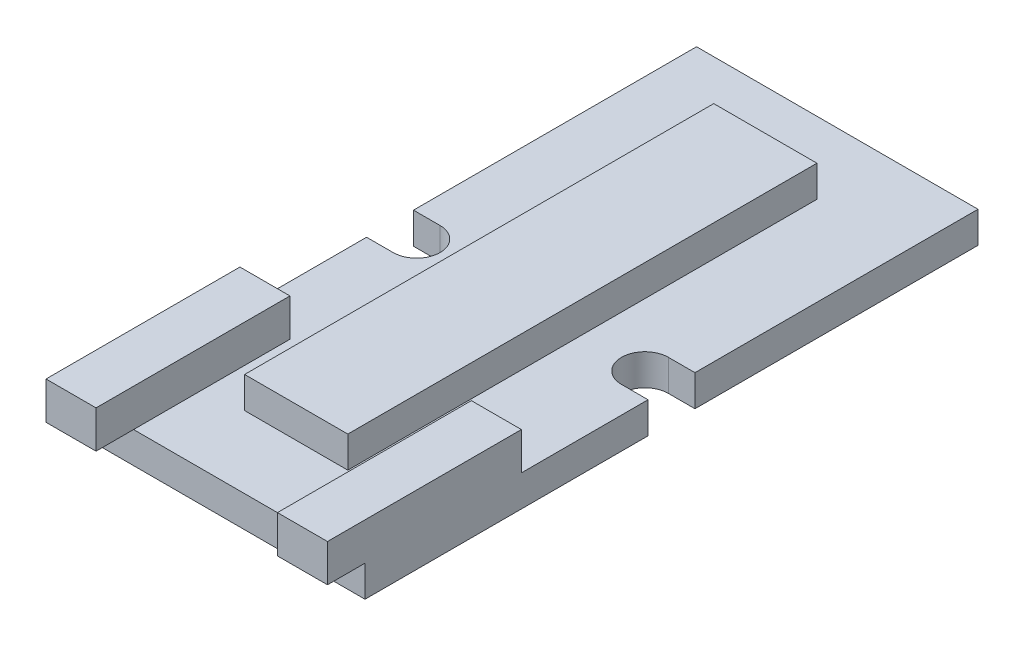
ISO-10303-21;
HEADER;
FILE_DESCRIPTION(('STEP AP214'),'2;1');
FILE_NAME('part.step','',(''),(''),'','','');
FILE_SCHEMA(('AUTOMOTIVE_DESIGN { 1 0 10303 214 1 1 1 1 }'));
ENDSEC;
DATA;
#1=APPLICATION_CONTEXT('core data for automotive mechanical design processes');
#2=APPLICATION_PROTOCOL_DEFINITION('international standard','automotive_design',2000,#1);
#3=PRODUCT_CONTEXT('',#1,'mechanical');
#4=PRODUCT('Part','Part','',(#3));
#5=PRODUCT_RELATED_PRODUCT_CATEGORY('part','',(#4));
#6=PRODUCT_DEFINITION_FORMATION('','',#4);
#7=PRODUCT_DEFINITION_CONTEXT('part definition',#1,'design');
#8=PRODUCT_DEFINITION('design','',#6,#7);
#9=PRODUCT_DEFINITION_SHAPE('','',#8);
#10=(LENGTH_UNIT() NAMED_UNIT(*) SI_UNIT(.MILLI.,.METRE.));
#11=(NAMED_UNIT(*) PLANE_ANGLE_UNIT() SI_UNIT($,.RADIAN.));
#12=(NAMED_UNIT(*) SI_UNIT($,.STERADIAN.) SOLID_ANGLE_UNIT());
#13=UNCERTAINTY_MEASURE_WITH_UNIT(LENGTH_MEASURE(1.E-05),#10,'distance_accuracy_value','');
#14=(GEOMETRIC_REPRESENTATION_CONTEXT(3) GLOBAL_UNCERTAINTY_ASSIGNED_CONTEXT((#13)) GLOBAL_UNIT_ASSIGNED_CONTEXT((#10,
#11,#12)) REPRESENTATION_CONTEXT('',''));
#15=CARTESIAN_POINT('',(0.,0.,0.));
#16=DIRECTION('',(0.,0.,1.));
#17=DIRECTION('',(1.,0.,0.));
#18=AXIS2_PLACEMENT_3D('',#15,#16,#17);
#19=CARTESIAN_POINT('',(0.,1.,9.8));
#20=DIRECTION('',(0.,0.,-1.));
#21=DIRECTION('',(-1.,0.,0.));
#22=AXIS2_PLACEMENT_3D('',#19,#20,#21);
#23=PLANE('',#22);
#24=DIRECTION('',(1.,0.,0.));
#25=VECTOR('',#24,1.);
#26=CARTESIAN_POINT('',(2.9,1.,9.8));
#27=LINE('',#26,#25);
#28=CARTESIAN_POINT('',(2.9,1.,9.8));
#29=VERTEX_POINT('',#28);
#30=CARTESIAN_POINT('',(4.5,1.,9.8));
#31=VERTEX_POINT('',#30);
#32=EDGE_CURVE('E232',#29,#31,#27,.T.);
#33=ORIENTED_EDGE('',*,*,#32,.F.);
#34=DIRECTION('',(1.,0.,0.));
#35=VECTOR('',#34,1.);
#36=CARTESIAN_POINT('',(0.,1.,9.8));
#37=LINE('',#36,#35);
#38=CARTESIAN_POINT('',(-2.9,1.,9.8));
#39=VERTEX_POINT('',#38);
#40=EDGE_CURVE('E390',#39,#29,#37,.T.);
#41=ORIENTED_EDGE('',*,*,#40,.F.);
#42=DIRECTION('',(1.,0.,0.));
#43=VECTOR('',#42,1.);
#44=CARTESIAN_POINT('',(-4.5,1.,9.8));
#45=LINE('',#44,#43);
#46=CARTESIAN_POINT('',(-4.5,1.,9.8));
#47=VERTEX_POINT('',#46);
#48=EDGE_CURVE('E57',#47,#39,#45,.T.);
#49=ORIENTED_EDGE('',*,*,#48,.F.);
#50=DIRECTION('',(0.,-1.,0.));
#51=VECTOR('',#50,1.);
#52=CARTESIAN_POINT('',(-4.5,1.,9.8));
#53=LINE('',#52,#51);
#54=CARTESIAN_POINT('',(-4.5,0.,9.8));
#55=VERTEX_POINT('',#54);
#56=EDGE_CURVE('E445',#47,#55,#53,.T.);
#57=ORIENTED_EDGE('',*,*,#56,.T.);
#58=DIRECTION('',(1.,0.,0.));
#59=VECTOR('',#58,1.);
#60=CARTESIAN_POINT('',(0.,0.,9.8));
#61=LINE('',#60,#59);
#62=CARTESIAN_POINT('',(4.5,0.,9.8));
#63=VERTEX_POINT('',#62);
#64=EDGE_CURVE('E430',#55,#63,#61,.T.);
#65=ORIENTED_EDGE('',*,*,#64,.T.);
#66=DIRECTION('',(0.,-1.,0.));
#67=VECTOR('',#66,1.);
#68=CARTESIAN_POINT('',(4.5,1.,9.8));
#69=LINE('',#68,#67);
#70=EDGE_CURVE('E442',#31,#63,#69,.T.);
#71=ORIENTED_EDGE('',*,*,#70,.F.);
#72=EDGE_LOOP('',(#33,#41,#49,#57,#65,#71));
#73=FACE_BOUND('',#72,.T.);
#74=ADVANCED_FACE('F41',(#73),#23,.F.);
#75=CARTESIAN_POINT('',(0.,1.,0.));
#76=DIRECTION('',(0.,1.,0.));
#77=DIRECTION('',(0.,0.,1.));
#78=AXIS2_PLACEMENT_3D('',#75,#76,#77);
#79=PLANE('',#78);
#80=DIRECTION('',(0.,0.,-1.));
#81=VECTOR('',#80,1.);
#82=CARTESIAN_POINT('',(1.65,1.,7.5));
#83=LINE('',#82,#81);
#84=CARTESIAN_POINT('',(1.65,1.,7.5));
#85=VERTEX_POINT('',#84);
#86=CARTESIAN_POINT('',(1.65,1.,-7.5));
#87=VERTEX_POINT('',#86);
#88=EDGE_CURVE('E311',#85,#87,#83,.T.);
#89=ORIENTED_EDGE('',*,*,#88,.F.);
#90=DIRECTION('',(1.,0.,0.));
#91=VECTOR('',#90,1.);
#92=CARTESIAN_POINT('',(-1.65,1.,7.5));
#93=LINE('',#92,#91);
#94=CARTESIAN_POINT('',(-1.65,1.,7.5));
#95=VERTEX_POINT('',#94);
#96=EDGE_CURVE('E317',#95,#85,#93,.T.);
#97=ORIENTED_EDGE('',*,*,#96,.F.);
#98=DIRECTION('',(0.,0.,1.));
#99=VECTOR('',#98,1.);
#100=CARTESIAN_POINT('',(-1.65,1.,7.5));
#101=LINE('',#100,#99);
#102=CARTESIAN_POINT('',(-1.65,1.,-7.5));
#103=VERTEX_POINT('',#102);
#104=EDGE_CURVE('E334',#103,#95,#101,.T.);
#105=ORIENTED_EDGE('',*,*,#104,.F.);
#106=DIRECTION('',(-1.,0.,0.));
#107=VECTOR('',#106,1.);
#108=CARTESIAN_POINT('',(-1.65,1.,-7.5));
#109=LINE('',#108,#107);
#110=EDGE_CURVE('E330',#87,#103,#109,.T.);
#111=ORIENTED_EDGE('',*,*,#110,.F.);
#112=EDGE_LOOP('',(#89,#97,#105,#111));
#113=FACE_BOUND('',#112,.T.);
#114=DIRECTION('',(0.,0.,1.));
#115=VECTOR('',#114,1.);
#116=CARTESIAN_POINT('',(2.9,1.,9.8));
#117=LINE('',#116,#115);
#118=CARTESIAN_POINT('',(2.9,1.,4.8));
#119=VERTEX_POINT('',#118);
#120=EDGE_CURVE('E65',#119,#29,#117,.T.);
#121=ORIENTED_EDGE('',*,*,#120,.F.);
#122=DIRECTION('',(-1.,0.,0.));
#123=VECTOR('',#122,1.);
#124=CARTESIAN_POINT('',(4.5,1.,4.8));
#125=LINE('',#124,#123);
#126=CARTESIAN_POINT('',(4.5,1.,4.8));
#127=VERTEX_POINT('',#126);
#128=EDGE_CURVE('E267',#127,#119,#125,.T.);
#129=ORIENTED_EDGE('',*,*,#128,.F.);
#130=DIRECTION('',(0.,0.,-1.));
#131=VECTOR('',#130,1.);
#132=CARTESIAN_POINT('',(4.5,1.,0.));
#133=LINE('',#132,#131);
#134=CARTESIAN_POINT('',(4.5,1.,0.75));
#135=VERTEX_POINT('',#134);
#136=EDGE_CURVE('E369',#127,#135,#133,.T.);
#137=ORIENTED_EDGE('',*,*,#136,.T.);
#138=DIRECTION('',(1.,0.,0.));
#139=VECTOR('',#138,1.);
#140=CARTESIAN_POINT('',(0.,1.,0.75));
#141=LINE('',#140,#139);
#142=CARTESIAN_POINT('',(3.65,1.,0.75));
#143=VERTEX_POINT('',#142);
#144=EDGE_CURVE('E393',#143,#135,#141,.T.);
#145=ORIENTED_EDGE('',*,*,#144,.F.);
#146=CARTESIAN_POINT('',(3.65,1.,0.));
#147=DIRECTION('',(0.,1.,0.));
#148=DIRECTION('',(0.,0.,1.));
#149=AXIS2_PLACEMENT_3D('',#146,#147,#148);
#150=CIRCLE('',#149,0.750000000000001);
#151=CARTESIAN_POINT('',(3.65,1.,-0.75));
#152=VERTEX_POINT('',#151);
#153=EDGE_CURVE('E357',#152,#143,#150,.T.);
#154=ORIENTED_EDGE('',*,*,#153,.F.);
#155=DIRECTION('',(1.,0.,0.));
#156=VECTOR('',#155,1.);
#157=CARTESIAN_POINT('',(0.,1.,-0.75));
#158=LINE('',#157,#156);
#159=CARTESIAN_POINT('',(4.5,1.,-0.75));
#160=VERTEX_POINT('',#159);
#161=EDGE_CURVE('E361',#152,#160,#158,.T.);
#162=ORIENTED_EDGE('',*,*,#161,.T.);
#163=CARTESIAN_POINT('',(4.5,1.,-9.8));
#164=VERTEX_POINT('',#163);
#165=EDGE_CURVE('E365',#160,#164,#133,.T.);
#166=ORIENTED_EDGE('',*,*,#165,.T.);
#167=DIRECTION('',(1.,0.,0.));
#168=VECTOR('',#167,1.);
#169=CARTESIAN_POINT('',(0.,1.,-9.8));
#170=LINE('',#169,#168);
#171=CARTESIAN_POINT('',(-4.5,1.,-9.8));
#172=VERTEX_POINT('',#171);
#173=EDGE_CURVE('E368',#172,#164,#170,.T.);
#174=ORIENTED_EDGE('',*,*,#173,.F.);
#175=DIRECTION('',(0.,0.,-1.));
#176=VECTOR('',#175,1.);
#177=CARTESIAN_POINT('',(-4.5,1.,0.));
#178=LINE('',#177,#176);
#179=CARTESIAN_POINT('',(-4.5,1.,-0.75));
#180=VERTEX_POINT('',#179);
#181=EDGE_CURVE('E373',#180,#172,#178,.T.);
#182=ORIENTED_EDGE('',*,*,#181,.F.);
#183=DIRECTION('',(-1.,0.,0.));
#184=VECTOR('',#183,1.);
#185=CARTESIAN_POINT('',(0.,1.,-0.75));
#186=LINE('',#185,#184);
#187=CARTESIAN_POINT('',(-3.65,1.,-0.75));
#188=VERTEX_POINT('',#187);
#189=EDGE_CURVE('E377',#188,#180,#186,.T.);
#190=ORIENTED_EDGE('',*,*,#189,.F.);
#191=CARTESIAN_POINT('',(-3.65,1.,0.));
#192=DIRECTION('',(0.,1.,0.));
#193=DIRECTION('',(0.,0.,1.));
#194=AXIS2_PLACEMENT_3D('',#191,#192,#193);
#195=CIRCLE('',#194,0.75);
#196=CARTESIAN_POINT('',(-3.65,1.,0.75));
#197=VERTEX_POINT('',#196);
#198=EDGE_CURVE('E382',#197,#188,#195,.T.);
#199=ORIENTED_EDGE('',*,*,#198,.F.);
#200=DIRECTION('',(-1.,0.,0.));
#201=VECTOR('',#200,1.);
#202=CARTESIAN_POINT('',(0.,1.,0.75));
#203=LINE('',#202,#201);
#204=CARTESIAN_POINT('',(-4.5,1.,0.75));
#205=VERTEX_POINT('',#204);
#206=EDGE_CURVE('E386',#197,#205,#203,.T.);
#207=ORIENTED_EDGE('',*,*,#206,.T.);
#208=CARTESIAN_POINT('',(-4.5,1.,4.8));
#209=VERTEX_POINT('',#208);
#210=EDGE_CURVE('E378',#209,#205,#178,.T.);
#211=ORIENTED_EDGE('',*,*,#210,.F.);
#212=DIRECTION('',(-1.,0.,0.));
#213=VECTOR('',#212,1.);
#214=CARTESIAN_POINT('',(-4.5,1.,4.8));
#215=LINE('',#214,#213);
#216=CARTESIAN_POINT('',(-2.9,1.,4.8));
#217=VERTEX_POINT('',#216);
#218=EDGE_CURVE('E293',#217,#209,#215,.T.);
#219=ORIENTED_EDGE('',*,*,#218,.F.);
#220=DIRECTION('',(0.,0.,-1.));
#221=VECTOR('',#220,1.);
#222=CARTESIAN_POINT('',(-2.9,1.,9.8));
#223=LINE('',#222,#221);
#224=EDGE_CURVE('E288',#39,#217,#223,.T.);
#225=ORIENTED_EDGE('',*,*,#224,.F.);
#226=ORIENTED_EDGE('',*,*,#40,.T.);
#227=EDGE_LOOP('',(#121,#129,#137,#145,#154,#162,#166,#174,#182,#190,#199,#207,#211,#219,#225,#226));
#228=FACE_BOUND('',#227,.T.);
#229=ADVANCED_FACE('F485',(#113,#228),#79,.T.);
#230=CARTESIAN_POINT('',(3.65,1.,0.));
#231=DIRECTION('',(0.,-1.,0.));
#232=DIRECTION('',(0.,0.,-1.));
#233=AXIS2_PLACEMENT_3D('',#230,#231,#232);
#234=CYLINDRICAL_SURFACE('',#233,0.750000000000001);
#235=CARTESIAN_POINT('',(3.65,0.,0.));
#236=DIRECTION('',(0.,1.,0.));
#237=DIRECTION('',(0.,0.,1.));
#238=AXIS2_PLACEMENT_3D('',#235,#236,#237);
#239=CIRCLE('',#238,0.750000000000001);
#240=CARTESIAN_POINT('',(3.65,0.,-0.75));
#241=VERTEX_POINT('',#240);
#242=CARTESIAN_POINT('',(3.65,0.,0.75));
#243=VERTEX_POINT('',#242);
#244=EDGE_CURVE('E356',#241,#243,#239,.T.);
#245=ORIENTED_EDGE('',*,*,#244,.F.);
#246=DIRECTION('',(0.,-1.,0.));
#247=VECTOR('',#246,1.);
#248=CARTESIAN_POINT('',(3.65,1.,-0.75));
#249=LINE('',#248,#247);
#250=EDGE_CURVE('E11',#152,#241,#249,.T.);
#251=ORIENTED_EDGE('',*,*,#250,.F.);
#252=ORIENTED_EDGE('',*,*,#153,.T.);
#253=DIRECTION('',(0.,-1.,0.));
#254=VECTOR('',#253,1.);
#255=CARTESIAN_POINT('',(3.65,1.,0.75));
#256=LINE('',#255,#254);
#257=EDGE_CURVE('E397',#143,#243,#256,.T.);
#258=ORIENTED_EDGE('',*,*,#257,.T.);
#259=EDGE_LOOP('',(#245,#251,#252,#258));
#260=FACE_BOUND('',#259,.T.);
#261=ADVANCED_FACE('F43',(#260),#234,.F.);
#262=CARTESIAN_POINT('',(0.,1.,-0.75));
#263=DIRECTION('',(0.,0.,-1.));
#264=DIRECTION('',(-1.,0.,0.));
#265=AXIS2_PLACEMENT_3D('',#262,#263,#264);
#266=PLANE('',#265);
#267=DIRECTION('',(1.,0.,0.));
#268=VECTOR('',#267,1.);
#269=CARTESIAN_POINT('',(0.,0.,-0.75));
#270=LINE('',#269,#268);
#271=CARTESIAN_POINT('',(4.5,0.,-0.75));
#272=VERTEX_POINT('',#271);
#273=EDGE_CURVE('E401',#241,#272,#270,.T.);
#274=ORIENTED_EDGE('',*,*,#273,.T.);
#275=DIRECTION('',(0.,-1.,0.));
#276=VECTOR('',#275,1.);
#277=CARTESIAN_POINT('',(4.5,1.,-0.75));
#278=LINE('',#277,#276);
#279=EDGE_CURVE('E50',#160,#272,#278,.T.);
#280=ORIENTED_EDGE('',*,*,#279,.F.);
#281=ORIENTED_EDGE('',*,*,#161,.F.);
#282=ORIENTED_EDGE('',*,*,#250,.T.);
#283=EDGE_LOOP('',(#274,#280,#281,#282));
#284=FACE_BOUND('',#283,.T.);
#285=ADVANCED_FACE('F556',(#284),#266,.F.);
#286=CARTESIAN_POINT('',(4.5,1.,0.));
#287=DIRECTION('',(-1.,0.,0.));
#288=DIRECTION('',(0.,0.,1.));
#289=AXIS2_PLACEMENT_3D('',#286,#287,#288);
#290=PLANE('',#289);
#291=DIRECTION('',(0.,0.,-1.));
#292=VECTOR('',#291,1.);
#293=CARTESIAN_POINT('',(4.5,0.,0.));
#294=LINE('',#293,#292);
#295=CARTESIAN_POINT('',(4.5,0.,-9.8));
#296=VERTEX_POINT('',#295);
#297=EDGE_CURVE('E404',#272,#296,#294,.T.);
#298=ORIENTED_EDGE('',*,*,#297,.T.);
#299=DIRECTION('',(0.,-1.,0.));
#300=VECTOR('',#299,1.);
#301=CARTESIAN_POINT('',(4.5,1.,-9.8));
#302=LINE('',#301,#300);
#303=EDGE_CURVE('E463',#164,#296,#302,.T.);
#304=ORIENTED_EDGE('',*,*,#303,.F.);
#305=ORIENTED_EDGE('',*,*,#165,.F.);
#306=ORIENTED_EDGE('',*,*,#279,.T.);
#307=EDGE_LOOP('',(#298,#304,#305,#306));
#308=FACE_BOUND('',#307,.T.);
#309=ADVANCED_FACE('F471',(#308),#290,.F.);
#310=CARTESIAN_POINT('',(0.,1.,-9.8));
#311=DIRECTION('',(0.,0.,-1.));
#312=DIRECTION('',(-1.,0.,0.));
#313=AXIS2_PLACEMENT_3D('',#310,#311,#312);
#314=PLANE('',#313);
#315=DIRECTION('',(1.,0.,0.));
#316=VECTOR('',#315,1.);
#317=CARTESIAN_POINT('',(0.,0.,-9.8));
#318=LINE('',#317,#316);
#319=CARTESIAN_POINT('',(-4.5,0.,-9.8));
#320=VERTEX_POINT('',#319);
#321=EDGE_CURVE('E408',#320,#296,#318,.T.);
#322=ORIENTED_EDGE('',*,*,#321,.F.);
#323=DIRECTION('',(0.,-1.,0.));
#324=VECTOR('',#323,1.);
#325=CARTESIAN_POINT('',(-4.5,1.,-9.8));
#326=LINE('',#325,#324);
#327=EDGE_CURVE('E460',#172,#320,#326,.T.);
#328=ORIENTED_EDGE('',*,*,#327,.F.);
#329=ORIENTED_EDGE('',*,*,#173,.T.);
#330=ORIENTED_EDGE('',*,*,#303,.T.);
#331=EDGE_LOOP('',(#322,#328,#329,#330));
#332=FACE_BOUND('',#331,.T.);
#333=ADVANCED_FACE('F482',(#332),#314,.T.);
#334=CARTESIAN_POINT('',(-4.5,1.,0.));
#335=DIRECTION('',(-1.,0.,0.));
#336=DIRECTION('',(0.,0.,1.));
#337=AXIS2_PLACEMENT_3D('',#334,#335,#336);
#338=PLANE('',#337);
#339=DIRECTION('',(0.,0.,-1.));
#340=VECTOR('',#339,1.);
#341=CARTESIAN_POINT('',(-4.5,0.,0.));
#342=LINE('',#341,#340);
#343=CARTESIAN_POINT('',(-4.5,0.,-0.75));
#344=VERTEX_POINT('',#343);
#345=EDGE_CURVE('E413',#344,#320,#342,.T.);
#346=ORIENTED_EDGE('',*,*,#345,.F.);
#347=DIRECTION('',(0.,-1.,0.));
#348=VECTOR('',#347,1.);
#349=CARTESIAN_POINT('',(-4.5,1.,-0.75));
#350=LINE('',#349,#348);
#351=EDGE_CURVE('E457',#180,#344,#350,.T.);
#352=ORIENTED_EDGE('',*,*,#351,.F.);
#353=ORIENTED_EDGE('',*,*,#181,.T.);
#354=ORIENTED_EDGE('',*,*,#327,.T.);
#355=EDGE_LOOP('',(#346,#352,#353,#354));
#356=FACE_BOUND('',#355,.T.);
#357=ADVANCED_FACE('F488',(#356),#338,.T.);
#358=CARTESIAN_POINT('',(0.,1.,-0.75));
#359=DIRECTION('',(0.,0.,1.));
#360=DIRECTION('',(1.,0.,0.));
#361=AXIS2_PLACEMENT_3D('',#358,#359,#360);
#362=PLANE('',#361);
#363=DIRECTION('',(-1.,0.,0.));
#364=VECTOR('',#363,1.);
#365=CARTESIAN_POINT('',(0.,0.,-0.75));
#366=LINE('',#365,#364);
#367=CARTESIAN_POINT('',(-3.65,0.,-0.75));
#368=VERTEX_POINT('',#367);
#369=EDGE_CURVE('E417',#368,#344,#366,.T.);
#370=ORIENTED_EDGE('',*,*,#369,.F.);
#371=DIRECTION('',(0.,-1.,0.));
#372=VECTOR('',#371,1.);
#373=CARTESIAN_POINT('',(-3.65,1.,-0.75));
#374=LINE('',#373,#372);
#375=EDGE_CURVE('E454',#188,#368,#374,.T.);
#376=ORIENTED_EDGE('',*,*,#375,.F.);
#377=ORIENTED_EDGE('',*,*,#189,.T.);
#378=ORIENTED_EDGE('',*,*,#351,.T.);
#379=EDGE_LOOP('',(#370,#376,#377,#378));
#380=FACE_BOUND('',#379,.T.);
#381=ADVANCED_FACE('F491',(#380),#362,.T.);
#382=CARTESIAN_POINT('',(-3.65,1.,0.));
#383=DIRECTION('',(0.,-1.,0.));
#384=DIRECTION('',(0.,0.,-1.));
#385=AXIS2_PLACEMENT_3D('',#382,#383,#384);
#386=CYLINDRICAL_SURFACE('',#385,0.75);
#387=CARTESIAN_POINT('',(-3.65,0.,0.));
#388=DIRECTION('',(0.,1.,0.));
#389=DIRECTION('',(0.,0.,1.));
#390=AXIS2_PLACEMENT_3D('',#387,#388,#389);
#391=CIRCLE('',#390,0.75);
#392=CARTESIAN_POINT('',(-3.65,0.,0.75));
#393=VERTEX_POINT('',#392);
#394=EDGE_CURVE('E422',#393,#368,#391,.T.);
#395=ORIENTED_EDGE('',*,*,#394,.F.);
#396=DIRECTION('',(0.,-1.,0.));
#397=VECTOR('',#396,1.);
#398=CARTESIAN_POINT('',(-3.65,1.,0.75));
#399=LINE('',#398,#397);
#400=EDGE_CURVE('E451',#197,#393,#399,.T.);
#401=ORIENTED_EDGE('',*,*,#400,.F.);
#402=ORIENTED_EDGE('',*,*,#198,.T.);
#403=ORIENTED_EDGE('',*,*,#375,.T.);
#404=EDGE_LOOP('',(#395,#401,#402,#403));
#405=FACE_BOUND('',#404,.T.);
#406=ADVANCED_FACE('F495',(#405),#386,.F.);
#407=CARTESIAN_POINT('',(0.,1.,0.75));
#408=DIRECTION('',(0.,0.,1.));
#409=DIRECTION('',(1.,0.,0.));
#410=AXIS2_PLACEMENT_3D('',#407,#408,#409);
#411=PLANE('',#410);
#412=DIRECTION('',(-1.,0.,0.));
#413=VECTOR('',#412,1.);
#414=CARTESIAN_POINT('',(0.,0.,0.75));
#415=LINE('',#414,#413);
#416=CARTESIAN_POINT('',(-4.5,0.,0.75));
#417=VERTEX_POINT('',#416);
#418=EDGE_CURVE('E426',#393,#417,#415,.T.);
#419=ORIENTED_EDGE('',*,*,#418,.T.);
#420=DIRECTION('',(0.,-1.,0.));
#421=VECTOR('',#420,1.);
#422=CARTESIAN_POINT('',(-4.5,1.,0.75));
#423=LINE('',#422,#421);
#424=EDGE_CURVE('E448',#205,#417,#423,.T.);
#425=ORIENTED_EDGE('',*,*,#424,.F.);
#426=ORIENTED_EDGE('',*,*,#206,.F.);
#427=ORIENTED_EDGE('',*,*,#400,.T.);
#428=EDGE_LOOP('',(#419,#425,#426,#427));
#429=FACE_BOUND('',#428,.T.);
#430=ADVANCED_FACE('F500',(#429),#411,.F.);
#431=EDGE_CURVE('E418',#55,#417,#342,.T.);
#432=ORIENTED_EDGE('',*,*,#431,.F.);
#433=ORIENTED_EDGE('',*,*,#56,.F.);
#434=DIRECTION('',(0.,0.,-1.));
#435=VECTOR('',#434,1.);
#436=CARTESIAN_POINT('',(-4.5,1.,11.));
#437=LINE('',#436,#435);
#438=CARTESIAN_POINT('',(-4.5,1.,11.));
#439=VERTEX_POINT('',#438);
#440=EDGE_CURVE('E263',#439,#47,#437,.T.);
#441=ORIENTED_EDGE('',*,*,#440,.F.);
#442=DIRECTION('',(0.,-1.,0.));
#443=VECTOR('',#442,1.);
#444=CARTESIAN_POINT('',(-4.5,2.2,11.));
#445=LINE('',#444,#443);
#446=CARTESIAN_POINT('',(-4.5,2.2,11.));
#447=VERTEX_POINT('',#446);
#448=EDGE_CURVE('E240',#447,#439,#445,.T.);
#449=ORIENTED_EDGE('',*,*,#448,.F.);
#450=DIRECTION('',(0.,0.,1.));
#451=VECTOR('',#450,1.);
#452=CARTESIAN_POINT('',(-4.5,2.2,9.8));
#453=LINE('',#452,#451);
#454=CARTESIAN_POINT('',(-4.5,2.2,4.8));
#455=VERTEX_POINT('',#454);
#456=EDGE_CURVE('E289',#455,#447,#453,.T.);
#457=ORIENTED_EDGE('',*,*,#456,.F.);
#458=DIRECTION('',(0.,-1.,0.));
#459=VECTOR('',#458,1.);
#460=CARTESIAN_POINT('',(-4.5,2.2,4.8));
#461=LINE('',#460,#459);
#462=EDGE_CURVE('E299',#455,#209,#461,.T.);
#463=ORIENTED_EDGE('',*,*,#462,.T.);
#464=ORIENTED_EDGE('',*,*,#210,.T.);
#465=ORIENTED_EDGE('',*,*,#424,.T.);
#466=EDGE_LOOP('',(#432,#433,#441,#449,#457,#463,#464,#465));
#467=FACE_BOUND('',#466,.T.);
#468=ADVANCED_FACE('F514',(#467),#338,.T.);
#469=CARTESIAN_POINT('',(4.5,0.,0.75));
#470=VERTEX_POINT('',#469);
#471=EDGE_CURVE('E409',#63,#470,#294,.T.);
#472=ORIENTED_EDGE('',*,*,#471,.T.);
#473=DIRECTION('',(0.,-1.,0.));
#474=VECTOR('',#473,1.);
#475=CARTESIAN_POINT('',(4.5,1.,0.75));
#476=LINE('',#475,#474);
#477=EDGE_CURVE('E439',#135,#470,#476,.T.);
#478=ORIENTED_EDGE('',*,*,#477,.F.);
#479=ORIENTED_EDGE('',*,*,#136,.F.);
#480=DIRECTION('',(0.,-1.,0.));
#481=VECTOR('',#480,1.);
#482=CARTESIAN_POINT('',(4.5,2.2,4.8));
#483=LINE('',#482,#481);
#484=CARTESIAN_POINT('',(4.5,2.2,4.8));
#485=VERTEX_POINT('',#484);
#486=EDGE_CURVE('E284',#485,#127,#483,.T.);
#487=ORIENTED_EDGE('',*,*,#486,.F.);
#488=DIRECTION('',(0.,0.,-1.));
#489=VECTOR('',#488,1.);
#490=CARTESIAN_POINT('',(4.5,2.2,9.8));
#491=LINE('',#490,#489);
#492=CARTESIAN_POINT('',(4.5,2.2,11.));
#493=VERTEX_POINT('',#492);
#494=EDGE_CURVE('E268',#493,#485,#491,.T.);
#495=ORIENTED_EDGE('',*,*,#494,.F.);
#496=DIRECTION('',(0.,1.,0.));
#497=VECTOR('',#496,1.);
#498=CARTESIAN_POINT('',(4.5,2.2,11.));
#499=LINE('',#498,#497);
#500=CARTESIAN_POINT('',(4.5,1.,11.));
#501=VERTEX_POINT('',#500);
#502=EDGE_CURVE('E221',#501,#493,#499,.T.);
#503=ORIENTED_EDGE('',*,*,#502,.F.);
#504=DIRECTION('',(0.,0.,-1.));
#505=VECTOR('',#504,1.);
#506=CARTESIAN_POINT('',(4.5,1.,11.));
#507=LINE('',#506,#505);
#508=EDGE_CURVE('E216',#501,#31,#507,.T.);
#509=ORIENTED_EDGE('',*,*,#508,.T.);
#510=ORIENTED_EDGE('',*,*,#70,.T.);
#511=EDGE_LOOP('',(#472,#478,#479,#487,#495,#503,#509,#510));
#512=FACE_BOUND('',#511,.T.);
#513=ADVANCED_FACE('F551',(#512),#290,.F.);
#514=CARTESIAN_POINT('',(0.,1.,0.75));
#515=DIRECTION('',(0.,0.,-1.));
#516=DIRECTION('',(-1.,0.,0.));
#517=AXIS2_PLACEMENT_3D('',#514,#515,#516);
#518=PLANE('',#517);
#519=DIRECTION('',(1.,0.,0.));
#520=VECTOR('',#519,1.);
#521=CARTESIAN_POINT('',(0.,0.,0.75));
#522=LINE('',#521,#520);
#523=EDGE_CURVE('E362',#243,#470,#522,.T.);
#524=ORIENTED_EDGE('',*,*,#523,.F.);
#525=ORIENTED_EDGE('',*,*,#257,.F.);
#526=ORIENTED_EDGE('',*,*,#144,.T.);
#527=ORIENTED_EDGE('',*,*,#477,.T.);
#528=EDGE_LOOP('',(#524,#525,#526,#527));
#529=FACE_BOUND('',#528,.T.);
#530=ADVANCED_FACE('F554',(#529),#518,.T.);
#531=CARTESIAN_POINT('',(0.,0.,0.));
#532=DIRECTION('',(0.,1.,0.));
#533=DIRECTION('',(0.,0.,1.));
#534=AXIS2_PLACEMENT_3D('',#531,#532,#533);
#535=PLANE('',#534);
#536=ORIENTED_EDGE('',*,*,#244,.T.);
#537=ORIENTED_EDGE('',*,*,#523,.T.);
#538=ORIENTED_EDGE('',*,*,#471,.F.);
#539=ORIENTED_EDGE('',*,*,#64,.F.);
#540=ORIENTED_EDGE('',*,*,#431,.T.);
#541=ORIENTED_EDGE('',*,*,#418,.F.);
#542=ORIENTED_EDGE('',*,*,#394,.T.);
#543=ORIENTED_EDGE('',*,*,#369,.T.);
#544=ORIENTED_EDGE('',*,*,#345,.T.);
#545=ORIENTED_EDGE('',*,*,#321,.T.);
#546=ORIENTED_EDGE('',*,*,#297,.F.);
#547=ORIENTED_EDGE('',*,*,#273,.F.);
#548=EDGE_LOOP('',(#536,#537,#538,#539,#540,#541,#542,#543,#544,#545,#546,#547));
#549=FACE_BOUND('',#548,.T.);
#550=ADVANCED_FACE('F477',(#549),#535,.F.);
#551=CARTESIAN_POINT('',(1.65,2.,7.5));
#552=DIRECTION('',(-1.,0.,0.));
#553=DIRECTION('',(0.,0.,1.));
#554=AXIS2_PLACEMENT_3D('',#551,#552,#553);
#555=PLANE('',#554);
#556=ORIENTED_EDGE('',*,*,#88,.T.);
#557=DIRECTION('',(0.,-1.,0.));
#558=VECTOR('',#557,1.);
#559=CARTESIAN_POINT('',(1.65,2.,-7.5));
#560=LINE('',#559,#558);
#561=CARTESIAN_POINT('',(1.65,2.,-7.5));
#562=VERTEX_POINT('',#561);
#563=EDGE_CURVE('E352',#562,#87,#560,.T.);
#564=ORIENTED_EDGE('',*,*,#563,.F.);
#565=DIRECTION('',(0.,0.,-1.));
#566=VECTOR('',#565,1.);
#567=CARTESIAN_POINT('',(1.65,2.,7.5));
#568=LINE('',#567,#566);
#569=CARTESIAN_POINT('',(1.65,2.,7.5));
#570=VERTEX_POINT('',#569);
#571=EDGE_CURVE('E312',#570,#562,#568,.T.);
#572=ORIENTED_EDGE('',*,*,#571,.F.);
#573=DIRECTION('',(0.,-1.,0.));
#574=VECTOR('',#573,1.);
#575=CARTESIAN_POINT('',(1.65,2.,7.5));
#576=LINE('',#575,#574);
#577=EDGE_CURVE('E326',#570,#85,#576,.T.);
#578=ORIENTED_EDGE('',*,*,#577,.T.);
#579=EDGE_LOOP('',(#556,#564,#572,#578));
#580=FACE_BOUND('',#579,.T.);
#581=ADVANCED_FACE('F620',(#580),#555,.F.);
#582=CARTESIAN_POINT('',(-1.65,2.,-7.5));
#583=DIRECTION('',(0.,0.,1.));
#584=DIRECTION('',(1.,0.,0.));
#585=AXIS2_PLACEMENT_3D('',#582,#583,#584);
#586=PLANE('',#585);
#587=ORIENTED_EDGE('',*,*,#110,.T.);
#588=DIRECTION('',(0.,-1.,0.));
#589=VECTOR('',#588,1.);
#590=CARTESIAN_POINT('',(-1.65,2.,-7.5));
#591=LINE('',#590,#589);
#592=CARTESIAN_POINT('',(-1.65,2.,-7.5));
#593=VERTEX_POINT('',#592);
#594=EDGE_CURVE('E348',#593,#103,#591,.T.);
#595=ORIENTED_EDGE('',*,*,#594,.F.);
#596=DIRECTION('',(-1.,0.,0.));
#597=VECTOR('',#596,1.);
#598=CARTESIAN_POINT('',(-1.65,2.,-7.5));
#599=LINE('',#598,#597);
#600=EDGE_CURVE('E316',#562,#593,#599,.T.);
#601=ORIENTED_EDGE('',*,*,#600,.F.);
#602=ORIENTED_EDGE('',*,*,#563,.T.);
#603=EDGE_LOOP('',(#587,#595,#601,#602));
#604=FACE_BOUND('',#603,.T.);
#605=ADVANCED_FACE('F627',(#604),#586,.F.);
#606=CARTESIAN_POINT('',(-1.65,2.,7.5));
#607=DIRECTION('',(1.,0.,0.));
#608=DIRECTION('',(0.,0.,-1.));
#609=AXIS2_PLACEMENT_3D('',#606,#607,#608);
#610=PLANE('',#609);
#611=ORIENTED_EDGE('',*,*,#104,.T.);
#612=DIRECTION('',(0.,-1.,0.));
#613=VECTOR('',#612,1.);
#614=CARTESIAN_POINT('',(-1.65,2.,7.5));
#615=LINE('',#614,#613);
#616=CARTESIAN_POINT('',(-1.65,2.,7.5));
#617=VERTEX_POINT('',#616);
#618=EDGE_CURVE('E344',#617,#95,#615,.T.);
#619=ORIENTED_EDGE('',*,*,#618,.F.);
#620=DIRECTION('',(0.,0.,1.));
#621=VECTOR('',#620,1.);
#622=CARTESIAN_POINT('',(-1.65,2.,7.5));
#623=LINE('',#622,#621);
#624=EDGE_CURVE('E320',#593,#617,#623,.T.);
#625=ORIENTED_EDGE('',*,*,#624,.F.);
#626=ORIENTED_EDGE('',*,*,#594,.T.);
#627=EDGE_LOOP('',(#611,#619,#625,#626));
#628=FACE_BOUND('',#627,.T.);
#629=ADVANCED_FACE('F635',(#628),#610,.F.);
#630=CARTESIAN_POINT('',(-1.65,2.,7.5));
#631=DIRECTION('',(0.,0.,-1.));
#632=DIRECTION('',(-1.,0.,0.));
#633=AXIS2_PLACEMENT_3D('',#630,#631,#632);
#634=PLANE('',#633);
#635=ORIENTED_EDGE('',*,*,#96,.T.);
#636=ORIENTED_EDGE('',*,*,#577,.F.);
#637=DIRECTION('',(1.,0.,0.));
#638=VECTOR('',#637,1.);
#639=CARTESIAN_POINT('',(-1.65,2.,7.5));
#640=LINE('',#639,#638);
#641=EDGE_CURVE('E323',#617,#570,#640,.T.);
#642=ORIENTED_EDGE('',*,*,#641,.F.);
#643=ORIENTED_EDGE('',*,*,#618,.T.);
#644=EDGE_LOOP('',(#635,#636,#642,#643));
#645=FACE_BOUND('',#644,.T.);
#646=ADVANCED_FACE('F643',(#645),#634,.F.);
#647=CARTESIAN_POINT('',(0.,2.,0.));
#648=DIRECTION('',(0.,-1.,0.));
#649=DIRECTION('',(0.,0.,-1.));
#650=AXIS2_PLACEMENT_3D('',#647,#648,#649);
#651=PLANE('',#650);
#652=ORIENTED_EDGE('',*,*,#571,.T.);
#653=ORIENTED_EDGE('',*,*,#600,.T.);
#654=ORIENTED_EDGE('',*,*,#624,.T.);
#655=ORIENTED_EDGE('',*,*,#641,.T.);
#656=EDGE_LOOP('',(#652,#653,#654,#655));
#657=FACE_BOUND('',#656,.T.);
#658=ADVANCED_FACE('F651',(#657),#651,.F.);
#659=CARTESIAN_POINT('',(-2.9,2.2,9.8));
#660=DIRECTION('',(-1.,0.,0.));
#661=DIRECTION('',(0.,0.,1.));
#662=AXIS2_PLACEMENT_3D('',#659,#660,#661);
#663=PLANE('',#662);
#664=ORIENTED_EDGE('',*,*,#224,.T.);
#665=DIRECTION('',(0.,-1.,0.));
#666=VECTOR('',#665,1.);
#667=CARTESIAN_POINT('',(-2.9,2.2,4.8));
#668=LINE('',#667,#666);
#669=CARTESIAN_POINT('',(-2.9,2.2,4.8));
#670=VERTEX_POINT('',#669);
#671=EDGE_CURVE('E308',#670,#217,#668,.T.);
#672=ORIENTED_EDGE('',*,*,#671,.F.);
#673=DIRECTION('',(0.,0.,-1.));
#674=VECTOR('',#673,1.);
#675=CARTESIAN_POINT('',(-2.9,2.2,9.8));
#676=LINE('',#675,#674);
#677=CARTESIAN_POINT('',(-2.9,2.2,11.));
#678=VERTEX_POINT('',#677);
#679=EDGE_CURVE('E292',#678,#670,#676,.T.);
#680=ORIENTED_EDGE('',*,*,#679,.F.);
#681=DIRECTION('',(0.,1.,0.));
#682=VECTOR('',#681,1.);
#683=CARTESIAN_POINT('',(-2.9,2.2,11.));
#684=LINE('',#683,#682);
#685=CARTESIAN_POINT('',(-2.9,1.,11.));
#686=VERTEX_POINT('',#685);
#687=EDGE_CURVE('E251',#686,#678,#684,.T.);
#688=ORIENTED_EDGE('',*,*,#687,.F.);
#689=DIRECTION('',(0.,0.,-1.));
#690=VECTOR('',#689,1.);
#691=CARTESIAN_POINT('',(-2.9,1.,11.));
#692=LINE('',#691,#690);
#693=EDGE_CURVE('E258',#686,#39,#692,.T.);
#694=ORIENTED_EDGE('',*,*,#693,.T.);
#695=EDGE_LOOP('',(#664,#672,#680,#688,#694));
#696=FACE_BOUND('',#695,.T.);
#697=ADVANCED_FACE('F533',(#696),#663,.F.);
#698=CARTESIAN_POINT('',(-4.5,2.2,4.8));
#699=DIRECTION('',(0.,0.,1.));
#700=DIRECTION('',(1.,0.,0.));
#701=AXIS2_PLACEMENT_3D('',#698,#699,#700);
#702=PLANE('',#701);
#703=ORIENTED_EDGE('',*,*,#218,.T.);
#704=ORIENTED_EDGE('',*,*,#462,.F.);
#705=DIRECTION('',(-1.,0.,0.));
#706=VECTOR('',#705,1.);
#707=CARTESIAN_POINT('',(-4.5,2.2,4.8));
#708=LINE('',#707,#706);
#709=EDGE_CURVE('E296',#670,#455,#708,.T.);
#710=ORIENTED_EDGE('',*,*,#709,.F.);
#711=ORIENTED_EDGE('',*,*,#671,.T.);
#712=EDGE_LOOP('',(#703,#704,#710,#711));
#713=FACE_BOUND('',#712,.T.);
#714=ADVANCED_FACE('F531',(#713),#702,.F.);
#715=CARTESIAN_POINT('',(0.,2.2,0.));
#716=DIRECTION('',(0.,-1.,0.));
#717=DIRECTION('',(0.,0.,-1.));
#718=AXIS2_PLACEMENT_3D('',#715,#716,#717);
#719=PLANE('',#718);
#720=ORIENTED_EDGE('',*,*,#456,.T.);
#721=DIRECTION('',(-1.,0.,0.));
#722=VECTOR('',#721,1.);
#723=CARTESIAN_POINT('',(-4.5,2.2,11.));
#724=LINE('',#723,#722);
#725=EDGE_CURVE('E255',#678,#447,#724,.T.);
#726=ORIENTED_EDGE('',*,*,#725,.F.);
#727=ORIENTED_EDGE('',*,*,#679,.T.);
#728=ORIENTED_EDGE('',*,*,#709,.T.);
#729=EDGE_LOOP('',(#720,#726,#727,#728));
#730=FACE_BOUND('',#729,.T.);
#731=ADVANCED_FACE('F527',(#730),#719,.F.);
#732=CARTESIAN_POINT('',(4.5,2.2,4.8));
#733=DIRECTION('',(0.,0.,1.));
#734=DIRECTION('',(1.,0.,0.));
#735=AXIS2_PLACEMENT_3D('',#732,#733,#734);
#736=PLANE('',#735);
#737=ORIENTED_EDGE('',*,*,#128,.T.);
#738=DIRECTION('',(0.,-1.,0.));
#739=VECTOR('',#738,1.);
#740=CARTESIAN_POINT('',(2.9,2.2,4.8));
#741=LINE('',#740,#739);
#742=CARTESIAN_POINT('',(2.9,2.2,4.8));
#743=VERTEX_POINT('',#742);
#744=EDGE_CURVE('E277',#743,#119,#741,.T.);
#745=ORIENTED_EDGE('',*,*,#744,.F.);
#746=DIRECTION('',(-1.,0.,0.));
#747=VECTOR('',#746,1.);
#748=CARTESIAN_POINT('',(4.5,2.2,4.8));
#749=LINE('',#748,#747);
#750=EDGE_CURVE('E271',#485,#743,#749,.T.);
#751=ORIENTED_EDGE('',*,*,#750,.F.);
#752=ORIENTED_EDGE('',*,*,#486,.T.);
#753=EDGE_LOOP('',(#737,#745,#751,#752));
#754=FACE_BOUND('',#753,.T.);
#755=ADVANCED_FACE('F547',(#754),#736,.F.);
#756=CARTESIAN_POINT('',(2.9,2.2,9.8));
#757=DIRECTION('',(1.,0.,0.));
#758=DIRECTION('',(0.,0.,-1.));
#759=AXIS2_PLACEMENT_3D('',#756,#757,#758);
#760=PLANE('',#759);
#761=ORIENTED_EDGE('',*,*,#120,.T.);
#762=DIRECTION('',(0.,0.,-1.));
#763=VECTOR('',#762,1.);
#764=CARTESIAN_POINT('',(2.9,1.,11.));
#765=LINE('',#764,#763);
#766=CARTESIAN_POINT('',(2.9,1.,11.));
#767=VERTEX_POINT('',#766);
#768=EDGE_CURVE('E213',#767,#29,#765,.T.);
#769=ORIENTED_EDGE('',*,*,#768,.F.);
#770=DIRECTION('',(0.,-1.,0.));
#771=VECTOR('',#770,1.);
#772=CARTESIAN_POINT('',(2.9,2.2,11.));
#773=LINE('',#772,#771);
#774=CARTESIAN_POINT('',(2.9,2.2,11.));
#775=VERTEX_POINT('',#774);
#776=EDGE_CURVE('E222',#775,#767,#773,.T.);
#777=ORIENTED_EDGE('',*,*,#776,.F.);
#778=DIRECTION('',(0.,0.,1.));
#779=VECTOR('',#778,1.);
#780=CARTESIAN_POINT('',(2.9,2.2,9.8));
#781=LINE('',#780,#779);
#782=EDGE_CURVE('E274',#743,#775,#781,.T.);
#783=ORIENTED_EDGE('',*,*,#782,.F.);
#784=ORIENTED_EDGE('',*,*,#744,.T.);
#785=EDGE_LOOP('',(#761,#769,#777,#783,#784));
#786=FACE_BOUND('',#785,.T.);
#787=ADVANCED_FACE('F234',(#786),#760,.F.);
#788=CARTESIAN_POINT('',(0.,2.2,0.));
#789=DIRECTION('',(0.,-1.,0.));
#790=DIRECTION('',(0.,0.,-1.));
#791=AXIS2_PLACEMENT_3D('',#788,#789,#790);
#792=PLANE('',#791);
#793=ORIENTED_EDGE('',*,*,#782,.T.);
#794=DIRECTION('',(-1.,0.,0.));
#795=VECTOR('',#794,1.);
#796=CARTESIAN_POINT('',(2.9,2.2,11.));
#797=LINE('',#796,#795);
#798=EDGE_CURVE('E228',#493,#775,#797,.T.);
#799=ORIENTED_EDGE('',*,*,#798,.F.);
#800=ORIENTED_EDGE('',*,*,#494,.T.);
#801=ORIENTED_EDGE('',*,*,#750,.T.);
#802=EDGE_LOOP('',(#793,#799,#800,#801));
#803=FACE_BOUND('',#802,.T.);
#804=ADVANCED_FACE('F542',(#803),#792,.F.);
#805=CARTESIAN_POINT('',(-4.5,1.,11.));
#806=DIRECTION('',(0.,1.,0.));
#807=DIRECTION('',(0.,0.,1.));
#808=AXIS2_PLACEMENT_3D('',#805,#806,#807);
#809=PLANE('',#808);
#810=ORIENTED_EDGE('',*,*,#48,.T.);
#811=ORIENTED_EDGE('',*,*,#693,.F.);
#812=DIRECTION('',(1.,0.,0.));
#813=VECTOR('',#812,1.);
#814=CARTESIAN_POINT('',(-4.5,1.,11.));
#815=LINE('',#814,#813);
#816=EDGE_CURVE('E248',#439,#686,#815,.T.);
#817=ORIENTED_EDGE('',*,*,#816,.F.);
#818=ORIENTED_EDGE('',*,*,#440,.T.);
#819=EDGE_LOOP('',(#810,#811,#817,#818));
#820=FACE_BOUND('',#819,.T.);
#821=ADVANCED_FACE('F518',(#820),#809,.F.);
#822=CARTESIAN_POINT('',(0.,0.,11.));
#823=DIRECTION('',(0.,0.,1.));
#824=DIRECTION('',(1.,0.,0.));
#825=AXIS2_PLACEMENT_3D('',#822,#823,#824);
#826=PLANE('',#825);
#827=ORIENTED_EDGE('',*,*,#448,.T.);
#828=ORIENTED_EDGE('',*,*,#816,.T.);
#829=ORIENTED_EDGE('',*,*,#687,.T.);
#830=ORIENTED_EDGE('',*,*,#725,.T.);
#831=EDGE_LOOP('',(#827,#828,#829,#830));
#832=FACE_BOUND('',#831,.T.);
#833=ADVANCED_FACE('F522',(#832),#826,.T.);
#834=CARTESIAN_POINT('',(2.9,1.,11.));
#835=DIRECTION('',(0.,1.,0.));
#836=DIRECTION('',(0.,0.,1.));
#837=AXIS2_PLACEMENT_3D('',#834,#835,#836);
#838=PLANE('',#837);
#839=ORIENTED_EDGE('',*,*,#32,.T.);
#840=ORIENTED_EDGE('',*,*,#508,.F.);
#841=DIRECTION('',(1.,0.,0.));
#842=VECTOR('',#841,1.);
#843=CARTESIAN_POINT('',(2.9,1.,11.));
#844=LINE('',#843,#842);
#845=EDGE_CURVE('E209',#767,#501,#844,.T.);
#846=ORIENTED_EDGE('',*,*,#845,.F.);
#847=ORIENTED_EDGE('',*,*,#768,.T.);
#848=EDGE_LOOP('',(#839,#840,#846,#847));
#849=FACE_BOUND('',#848,.T.);
#850=ADVANCED_FACE('F211',(#849),#838,.F.);
#851=CARTESIAN_POINT('',(0.,0.,11.));
#852=DIRECTION('',(0.,0.,1.));
#853=DIRECTION('',(1.,0.,0.));
#854=AXIS2_PLACEMENT_3D('',#851,#852,#853);
#855=PLANE('',#854);
#856=ORIENTED_EDGE('',*,*,#776,.T.);
#857=ORIENTED_EDGE('',*,*,#845,.T.);
#858=ORIENTED_EDGE('',*,*,#502,.T.);
#859=ORIENTED_EDGE('',*,*,#798,.T.);
#860=EDGE_LOOP('',(#856,#857,#858,#859));
#861=FACE_BOUND('',#860,.T.);
#862=ADVANCED_FACE('F226',(#861),#855,.T.);
#863=CLOSED_SHELL('',(#74,#229,#261,#285,#309,#333,#357,#381,#406,#430,#468,#513,#530,#550,#581,
#605,#629,#646,#658,#697,#714,#731,#755,#787,#804,#821,#833,#850,#862));
#864=MANIFOLD_SOLID_BREP('B2',#863);
#865=ADVANCED_BREP_SHAPE_REPRESENTATION('',(#18,#864),#14);
#866=SHAPE_DEFINITION_REPRESENTATION(#9,#865);
ENDSEC;
END-ISO-10303-21;
